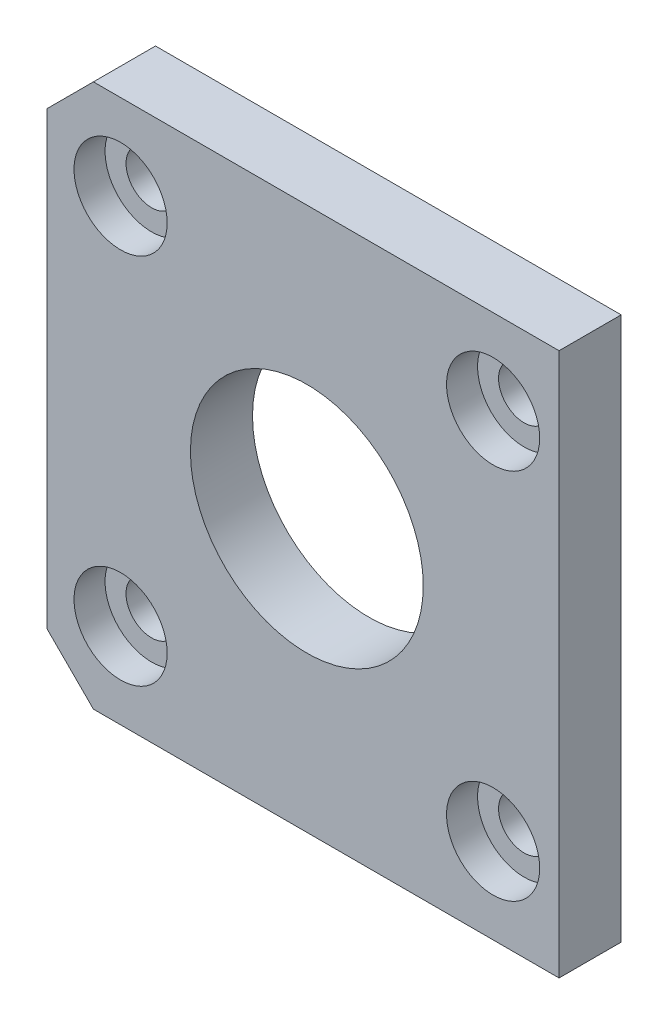
ISO-10303-21;
HEADER;
FILE_DESCRIPTION(('STEP AP214'),'2;1');
FILE_NAME('part.step','',(''),(''),'','','');
FILE_SCHEMA(('AUTOMOTIVE_DESIGN { 1 0 10303 214 1 1 1 1 }'));
ENDSEC;
DATA;
#1=APPLICATION_CONTEXT('core data for automotive mechanical design processes');
#2=APPLICATION_PROTOCOL_DEFINITION('international standard','automotive_design',2000,#1);
#3=PRODUCT_CONTEXT('',#1,'mechanical');
#4=PRODUCT('Part','Part','',(#3));
#5=PRODUCT_RELATED_PRODUCT_CATEGORY('part','',(#4));
#6=PRODUCT_DEFINITION_FORMATION('','',#4);
#7=PRODUCT_DEFINITION_CONTEXT('part definition',#1,'design');
#8=PRODUCT_DEFINITION('design','',#6,#7);
#9=PRODUCT_DEFINITION_SHAPE('','',#8);
#10=(LENGTH_UNIT() NAMED_UNIT(*) SI_UNIT(.MILLI.,.METRE.));
#11=(NAMED_UNIT(*) PLANE_ANGLE_UNIT() SI_UNIT($,.RADIAN.));
#12=(NAMED_UNIT(*) SI_UNIT($,.STERADIAN.) SOLID_ANGLE_UNIT());
#13=UNCERTAINTY_MEASURE_WITH_UNIT(LENGTH_MEASURE(1.E-05),#10,'distance_accuracy_value','');
#14=(GEOMETRIC_REPRESENTATION_CONTEXT(3) GLOBAL_UNCERTAINTY_ASSIGNED_CONTEXT((#13)) GLOBAL_UNIT_ASSIGNED_CONTEXT((#10,
#11,#12)) REPRESENTATION_CONTEXT('',''));
#15=CARTESIAN_POINT('',(0.,0.,0.));
#16=DIRECTION('',(0.,0.,1.));
#17=DIRECTION('',(1.,0.,0.));
#18=AXIS2_PLACEMENT_3D('',#15,#16,#17);
#19=CARTESIAN_POINT('',(4.75,29.5,4.));
#20=DIRECTION('',(0.,0.,-1.));
#21=DIRECTION('',(-1.,0.,0.));
#22=AXIS2_PLACEMENT_3D('',#19,#20,#21);
#23=CYLINDRICAL_SURFACE('',#22,1.65);
#24=CARTESIAN_POINT('',(4.75,29.5,0.));
#25=DIRECTION('',(0.,0.,1.));
#26=DIRECTION('',(1.,0.,0.));
#27=AXIS2_PLACEMENT_3D('',#24,#25,#26);
#28=CIRCLE('',#27,1.65);
#29=CARTESIAN_POINT('',(6.4,29.5,0.));
#30=VERTEX_POINT('',#29);
#31=EDGE_CURVE('E194',#30,#30,#28,.T.);
#32=ORIENTED_EDGE('',*,*,#31,.F.);
#33=EDGE_LOOP('',(#32));
#34=FACE_BOUND('',#33,.T.);
#35=CARTESIAN_POINT('',(4.75,29.5,2.));
#36=DIRECTION('',(0.,0.,1.));
#37=DIRECTION('',(1.,0.,0.));
#38=AXIS2_PLACEMENT_3D('',#35,#36,#37);
#39=CIRCLE('',#38,1.65);
#40=CARTESIAN_POINT('',(6.4,29.5,2.));
#41=VERTEX_POINT('',#40);
#42=EDGE_CURVE('E43',#41,#41,#39,.T.);
#43=ORIENTED_EDGE('',*,*,#42,.T.);
#44=EDGE_LOOP('',(#43));
#45=FACE_BOUND('',#44,.T.);
#46=ADVANCED_FACE('F39',(#34,#45),#23,.F.);
#47=CARTESIAN_POINT('',(28.75,29.5,4.));
#48=DIRECTION('',(0.,0.,-1.));
#49=DIRECTION('',(-1.,0.,0.));
#50=AXIS2_PLACEMENT_3D('',#47,#48,#49);
#51=CYLINDRICAL_SURFACE('',#50,1.65);
#52=CARTESIAN_POINT('',(28.75,29.5,0.));
#53=DIRECTION('',(0.,0.,1.));
#54=DIRECTION('',(1.,0.,0.));
#55=AXIS2_PLACEMENT_3D('',#52,#53,#54);
#56=CIRCLE('',#55,1.65);
#57=CARTESIAN_POINT('',(30.4,29.5,0.));
#58=VERTEX_POINT('',#57);
#59=EDGE_CURVE('E185',#58,#58,#56,.T.);
#60=ORIENTED_EDGE('',*,*,#59,.F.);
#61=EDGE_LOOP('',(#60));
#62=FACE_BOUND('',#61,.T.);
#63=CARTESIAN_POINT('',(28.75,29.5,2.));
#64=DIRECTION('',(0.,0.,1.));
#65=DIRECTION('',(1.,0.,0.));
#66=AXIS2_PLACEMENT_3D('',#63,#64,#65);
#67=CIRCLE('',#66,1.65);
#68=CARTESIAN_POINT('',(30.4,29.5,2.));
#69=VERTEX_POINT('',#68);
#70=EDGE_CURVE('E167',#69,#69,#67,.T.);
#71=ORIENTED_EDGE('',*,*,#70,.T.);
#72=EDGE_LOOP('',(#71));
#73=FACE_BOUND('',#72,.T.);
#74=ADVANCED_FACE('F234',(#62,#73),#51,.F.);
#75=CARTESIAN_POINT('',(4.75,5.5,4.));
#76=DIRECTION('',(0.,0.,-1.));
#77=DIRECTION('',(-1.,0.,0.));
#78=AXIS2_PLACEMENT_3D('',#75,#76,#77);
#79=CYLINDRICAL_SURFACE('',#78,1.65);
#80=CARTESIAN_POINT('',(4.75,5.5,0.));
#81=DIRECTION('',(0.,0.,1.));
#82=DIRECTION('',(1.,0.,0.));
#83=AXIS2_PLACEMENT_3D('',#80,#81,#82);
#84=CIRCLE('',#83,1.65);
#85=CARTESIAN_POINT('',(6.4,5.5,0.));
#86=VERTEX_POINT('',#85);
#87=EDGE_CURVE('E179',#86,#86,#84,.T.);
#88=ORIENTED_EDGE('',*,*,#87,.F.);
#89=EDGE_LOOP('',(#88));
#90=FACE_BOUND('',#89,.T.);
#91=CARTESIAN_POINT('',(4.75,5.5,2.));
#92=DIRECTION('',(0.,0.,1.));
#93=DIRECTION('',(1.,0.,0.));
#94=AXIS2_PLACEMENT_3D('',#91,#92,#93);
#95=CIRCLE('',#94,1.65);
#96=CARTESIAN_POINT('',(6.4,5.5,2.));
#97=VERTEX_POINT('',#96);
#98=EDGE_CURVE('E163',#97,#97,#95,.T.);
#99=ORIENTED_EDGE('',*,*,#98,.T.);
#100=EDGE_LOOP('',(#99));
#101=FACE_BOUND('',#100,.T.);
#102=ADVANCED_FACE('F240',(#90,#101),#79,.F.);
#103=CARTESIAN_POINT('',(28.75,5.5,4.));
#104=DIRECTION('',(0.,0.,-1.));
#105=DIRECTION('',(-1.,0.,0.));
#106=AXIS2_PLACEMENT_3D('',#103,#104,#105);
#107=CYLINDRICAL_SURFACE('',#106,1.65);
#108=CARTESIAN_POINT('',(28.75,5.5,0.));
#109=DIRECTION('',(0.,0.,1.));
#110=DIRECTION('',(1.,0.,0.));
#111=AXIS2_PLACEMENT_3D('',#108,#109,#110);
#112=CIRCLE('',#111,1.65);
#113=CARTESIAN_POINT('',(30.4,5.5,0.));
#114=VERTEX_POINT('',#113);
#115=EDGE_CURVE('E174',#114,#114,#112,.T.);
#116=ORIENTED_EDGE('',*,*,#115,.F.);
#117=EDGE_LOOP('',(#116));
#118=FACE_BOUND('',#117,.T.);
#119=CARTESIAN_POINT('',(28.75,5.5,2.));
#120=DIRECTION('',(0.,0.,1.));
#121=DIRECTION('',(1.,0.,0.));
#122=AXIS2_PLACEMENT_3D('',#119,#120,#121);
#123=CIRCLE('',#122,1.65);
#124=CARTESIAN_POINT('',(30.4,5.5,2.));
#125=VERTEX_POINT('',#124);
#126=EDGE_CURVE('E159',#125,#125,#123,.T.);
#127=ORIENTED_EDGE('',*,*,#126,.T.);
#128=EDGE_LOOP('',(#127));
#129=FACE_BOUND('',#128,.T.);
#130=ADVANCED_FACE('F247',(#118,#129),#107,.F.);
#131=CARTESIAN_POINT('',(0.,0.,4.));
#132=DIRECTION('',(0.,0.,-1.));
#133=DIRECTION('',(-1.,0.,0.));
#134=AXIS2_PLACEMENT_3D('',#131,#132,#133);
#135=PLANE('',#134);
#136=CARTESIAN_POINT('',(28.75,29.5,4.));
#137=DIRECTION('',(0.,0.,1.));
#138=DIRECTION('',(1.,0.,0.));
#139=AXIS2_PLACEMENT_3D('',#136,#137,#138);
#140=CIRCLE('',#139,2.99999999999999);
#141=CARTESIAN_POINT('',(31.75,29.5,4.));
#142=VERTEX_POINT('',#141);
#143=EDGE_CURVE('E272',#142,#142,#140,.T.);
#144=ORIENTED_EDGE('',*,*,#143,.F.);
#145=EDGE_LOOP('',(#144));
#146=FACE_BOUND('',#145,.T.);
#147=CARTESIAN_POINT('',(4.75,5.5,4.));
#148=DIRECTION('',(0.,0.,1.));
#149=DIRECTION('',(1.,0.,0.));
#150=AXIS2_PLACEMENT_3D('',#147,#148,#149);
#151=CIRCLE('',#150,3.);
#152=CARTESIAN_POINT('',(7.75,5.5,4.));
#153=VERTEX_POINT('',#152);
#154=EDGE_CURVE('E273',#153,#153,#151,.T.);
#155=ORIENTED_EDGE('',*,*,#154,.F.);
#156=EDGE_LOOP('',(#155));
#157=FACE_BOUND('',#156,.T.);
#158=CARTESIAN_POINT('',(28.75,5.5,4.));
#159=DIRECTION('',(0.,0.,1.));
#160=DIRECTION('',(1.,0.,0.));
#161=AXIS2_PLACEMENT_3D('',#158,#159,#160);
#162=CIRCLE('',#161,2.99999999999999);
#163=CARTESIAN_POINT('',(31.75,5.5,4.));
#164=VERTEX_POINT('',#163);
#165=EDGE_CURVE('E297',#164,#164,#162,.T.);
#166=ORIENTED_EDGE('',*,*,#165,.F.);
#167=EDGE_LOOP('',(#166));
#168=FACE_BOUND('',#167,.T.);
#169=CARTESIAN_POINT('',(4.75,29.5,4.));
#170=DIRECTION('',(0.,0.,1.));
#171=DIRECTION('',(1.,0.,0.));
#172=AXIS2_PLACEMENT_3D('',#169,#170,#171);
#173=CIRCLE('',#172,3.);
#174=CARTESIAN_POINT('',(7.75,29.5,4.));
#175=VERTEX_POINT('',#174);
#176=EDGE_CURVE('E188',#175,#175,#173,.T.);
#177=ORIENTED_EDGE('',*,*,#176,.F.);
#178=EDGE_LOOP('',(#177));
#179=FACE_BOUND('',#178,.T.);
#180=DIRECTION('',(0.,1.,0.));
#181=VECTOR('',#180,1.);
#182=CARTESIAN_POINT('',(33.,0.,4.));
#183=LINE('',#182,#181);
#184=CARTESIAN_POINT('',(33.,0.,4.));
#185=VERTEX_POINT('',#184);
#186=CARTESIAN_POINT('',(33.,35.,4.));
#187=VERTEX_POINT('',#186);
#188=EDGE_CURVE('E149',#185,#187,#183,.T.);
#189=ORIENTED_EDGE('',*,*,#188,.T.);
#190=DIRECTION('',(-1.,0.,0.));
#191=VECTOR('',#190,1.);
#192=CARTESIAN_POINT('',(3.,35.,4.));
#193=LINE('',#192,#191);
#194=CARTESIAN_POINT('',(3.,35.,4.));
#195=VERTEX_POINT('',#194);
#196=EDGE_CURVE('E96',#187,#195,#193,.T.);
#197=ORIENTED_EDGE('',*,*,#196,.T.);
#198=DIRECTION('',(-0.707106781186547,-0.707106781186548,0.));
#199=VECTOR('',#198,1.);
#200=CARTESIAN_POINT('',(0.,32.,4.));
#201=LINE('',#200,#199);
#202=CARTESIAN_POINT('',(0.,32.,4.));
#203=VERTEX_POINT('',#202);
#204=EDGE_CURVE('E110',#195,#203,#201,.T.);
#205=ORIENTED_EDGE('',*,*,#204,.T.);
#206=DIRECTION('',(0.,-1.,0.));
#207=VECTOR('',#206,1.);
#208=CARTESIAN_POINT('',(0.,3.,4.));
#209=LINE('',#208,#207);
#210=CARTESIAN_POINT('',(0.,3.,4.));
#211=VERTEX_POINT('',#210);
#212=EDGE_CURVE('E103',#203,#211,#209,.T.);
#213=ORIENTED_EDGE('',*,*,#212,.T.);
#214=DIRECTION('',(0.707106781186548,-0.707106781186548,0.));
#215=VECTOR('',#214,1.);
#216=CARTESIAN_POINT('',(0.,3.,4.));
#217=LINE('',#216,#215);
#218=CARTESIAN_POINT('',(3.,0.,4.));
#219=VERTEX_POINT('',#218);
#220=EDGE_CURVE('E108',#211,#219,#217,.T.);
#221=ORIENTED_EDGE('',*,*,#220,.T.);
#222=DIRECTION('',(1.,0.,0.));
#223=VECTOR('',#222,1.);
#224=CARTESIAN_POINT('',(3.,0.,4.));
#225=LINE('',#224,#223);
#226=EDGE_CURVE('E59',#219,#185,#225,.T.);
#227=ORIENTED_EDGE('',*,*,#226,.T.);
#228=EDGE_LOOP('',(#189,#197,#205,#213,#221,#227));
#229=FACE_BOUND('',#228,.T.);
#230=CARTESIAN_POINT('',(16.75,17.5,4.));
#231=DIRECTION('',(0.,0.,1.));
#232=DIRECTION('',(1.,0.,0.));
#233=AXIS2_PLACEMENT_3D('',#230,#231,#232);
#234=CIRCLE('',#233,7.5);
#235=CARTESIAN_POINT('',(24.25,17.5,4.));
#236=VERTEX_POINT('',#235);
#237=EDGE_CURVE('E137',#236,#236,#234,.T.);
#238=ORIENTED_EDGE('',*,*,#237,.F.);
#239=EDGE_LOOP('',(#238));
#240=FACE_BOUND('',#239,.T.);
#241=ADVANCED_FACE('F105',(#146,#157,#168,#179,#229,#240),#135,.F.);
#242=CARTESIAN_POINT('',(0.,0.,0.));
#243=DIRECTION('',(0.,0.,-1.));
#244=DIRECTION('',(-1.,0.,0.));
#245=AXIS2_PLACEMENT_3D('',#242,#243,#244);
#246=PLANE('',#245);
#247=ORIENTED_EDGE('',*,*,#87,.T.);
#248=EDGE_LOOP('',(#247));
#249=FACE_BOUND('',#248,.T.);
#250=ORIENTED_EDGE('',*,*,#31,.T.);
#251=EDGE_LOOP('',(#250));
#252=FACE_BOUND('',#251,.T.);
#253=DIRECTION('',(0.,1.,0.));
#254=VECTOR('',#253,1.);
#255=CARTESIAN_POINT('',(33.,0.,0.));
#256=LINE('',#255,#254);
#257=CARTESIAN_POINT('',(33.,0.,0.));
#258=VERTEX_POINT('',#257);
#259=CARTESIAN_POINT('',(33.,35.,0.));
#260=VERTEX_POINT('',#259);
#261=EDGE_CURVE('E132',#258,#260,#256,.T.);
#262=ORIENTED_EDGE('',*,*,#261,.F.);
#263=DIRECTION('',(1.,0.,0.));
#264=VECTOR('',#263,1.);
#265=CARTESIAN_POINT('',(3.,0.,0.));
#266=LINE('',#265,#264);
#267=CARTESIAN_POINT('',(3.,0.,0.));
#268=VERTEX_POINT('',#267);
#269=EDGE_CURVE('E88',#268,#258,#266,.T.);
#270=ORIENTED_EDGE('',*,*,#269,.F.);
#271=DIRECTION('',(0.707106781186548,-0.707106781186548,0.));
#272=VECTOR('',#271,1.);
#273=CARTESIAN_POINT('',(0.,3.,0.));
#274=LINE('',#273,#272);
#275=CARTESIAN_POINT('',(0.,3.,0.));
#276=VERTEX_POINT('',#275);
#277=EDGE_CURVE('E82',#276,#268,#274,.T.);
#278=ORIENTED_EDGE('',*,*,#277,.F.);
#279=DIRECTION('',(0.,-1.,0.));
#280=VECTOR('',#279,1.);
#281=CARTESIAN_POINT('',(0.,3.,0.));
#282=LINE('',#281,#280);
#283=CARTESIAN_POINT('',(0.,32.,0.));
#284=VERTEX_POINT('',#283);
#285=EDGE_CURVE('E119',#284,#276,#282,.T.);
#286=ORIENTED_EDGE('',*,*,#285,.F.);
#287=DIRECTION('',(-0.707106781186547,-0.707106781186548,0.));
#288=VECTOR('',#287,1.);
#289=CARTESIAN_POINT('',(0.,32.,0.));
#290=LINE('',#289,#288);
#291=CARTESIAN_POINT('',(3.,35.,0.));
#292=VERTEX_POINT('',#291);
#293=EDGE_CURVE('E140',#292,#284,#290,.T.);
#294=ORIENTED_EDGE('',*,*,#293,.F.);
#295=DIRECTION('',(-1.,0.,0.));
#296=VECTOR('',#295,1.);
#297=CARTESIAN_POINT('',(3.,35.,0.));
#298=LINE('',#297,#296);
#299=EDGE_CURVE('E136',#260,#292,#298,.T.);
#300=ORIENTED_EDGE('',*,*,#299,.F.);
#301=EDGE_LOOP('',(#262,#270,#278,#286,#294,#300));
#302=FACE_BOUND('',#301,.T.);
#303=CARTESIAN_POINT('',(16.75,17.5,0.));
#304=DIRECTION('',(0.,0.,1.));
#305=DIRECTION('',(1.,0.,0.));
#306=AXIS2_PLACEMENT_3D('',#303,#304,#305);
#307=CIRCLE('',#306,7.5);
#308=CARTESIAN_POINT('',(24.25,17.5,0.));
#309=VERTEX_POINT('',#308);
#310=EDGE_CURVE('E198',#309,#309,#307,.T.);
#311=ORIENTED_EDGE('',*,*,#310,.T.);
#312=EDGE_LOOP('',(#311));
#313=FACE_BOUND('',#312,.T.);
#314=ORIENTED_EDGE('',*,*,#59,.T.);
#315=EDGE_LOOP('',(#314));
#316=FACE_BOUND('',#315,.T.);
#317=ORIENTED_EDGE('',*,*,#115,.T.);
#318=EDGE_LOOP('',(#317));
#319=FACE_BOUND('',#318,.T.);
#320=ADVANCED_FACE('F217',(#249,#252,#302,#313,#316,#319),#246,.T.);
#321=CARTESIAN_POINT('',(33.,0.,4.));
#322=DIRECTION('',(-1.,0.,0.));
#323=DIRECTION('',(0.,0.,1.));
#324=AXIS2_PLACEMENT_3D('',#321,#322,#323);
#325=PLANE('',#324);
#326=ORIENTED_EDGE('',*,*,#261,.T.);
#327=DIRECTION('',(0.,0.,-1.));
#328=VECTOR('',#327,1.);
#329=CARTESIAN_POINT('',(33.,35.,4.));
#330=LINE('',#329,#328);
#331=EDGE_CURVE('E11',#187,#260,#330,.T.);
#332=ORIENTED_EDGE('',*,*,#331,.F.);
#333=ORIENTED_EDGE('',*,*,#188,.F.);
#334=DIRECTION('',(0.,0.,-1.));
#335=VECTOR('',#334,1.);
#336=CARTESIAN_POINT('',(33.,0.,4.));
#337=LINE('',#336,#335);
#338=EDGE_CURVE('E128',#185,#258,#337,.T.);
#339=ORIENTED_EDGE('',*,*,#338,.T.);
#340=EDGE_LOOP('',(#326,#332,#333,#339));
#341=FACE_BOUND('',#340,.T.);
#342=ADVANCED_FACE('F41',(#341),#325,.F.);
#343=CARTESIAN_POINT('',(3.,35.,4.));
#344=DIRECTION('',(0.,-1.,0.));
#345=DIRECTION('',(0.,0.,-1.));
#346=AXIS2_PLACEMENT_3D('',#343,#344,#345);
#347=PLANE('',#346);
#348=ORIENTED_EDGE('',*,*,#299,.T.);
#349=DIRECTION('',(0.,0.,-1.));
#350=VECTOR('',#349,1.);
#351=CARTESIAN_POINT('',(3.,35.,4.));
#352=LINE('',#351,#350);
#353=EDGE_CURVE('E50',#195,#292,#352,.T.);
#354=ORIENTED_EDGE('',*,*,#353,.F.);
#355=ORIENTED_EDGE('',*,*,#196,.F.);
#356=ORIENTED_EDGE('',*,*,#331,.T.);
#357=EDGE_LOOP('',(#348,#354,#355,#356));
#358=FACE_BOUND('',#357,.T.);
#359=ADVANCED_FACE('F211',(#358),#347,.F.);
#360=CARTESIAN_POINT('',(0.,32.,4.));
#361=DIRECTION('',(0.707106781186548,-0.707106781186547,0.));
#362=DIRECTION('',(0.707106781186547,0.707106781186548,0.));
#363=AXIS2_PLACEMENT_3D('',#360,#361,#362);
#364=PLANE('',#363);
#365=ORIENTED_EDGE('',*,*,#293,.T.);
#366=DIRECTION('',(0.,0.,-1.));
#367=VECTOR('',#366,1.);
#368=CARTESIAN_POINT('',(0.,32.,4.));
#369=LINE('',#368,#367);
#370=EDGE_CURVE('E121',#203,#284,#369,.T.);
#371=ORIENTED_EDGE('',*,*,#370,.F.);
#372=ORIENTED_EDGE('',*,*,#204,.F.);
#373=ORIENTED_EDGE('',*,*,#353,.T.);
#374=EDGE_LOOP('',(#365,#371,#372,#373));
#375=FACE_BOUND('',#374,.T.);
#376=ADVANCED_FACE('F214',(#375),#364,.F.);
#377=CARTESIAN_POINT('',(0.,3.,4.));
#378=DIRECTION('',(1.,0.,0.));
#379=DIRECTION('',(0.,0.,-1.));
#380=AXIS2_PLACEMENT_3D('',#377,#378,#379);
#381=PLANE('',#380);
#382=ORIENTED_EDGE('',*,*,#285,.T.);
#383=DIRECTION('',(0.,0.,-1.));
#384=VECTOR('',#383,1.);
#385=CARTESIAN_POINT('',(0.,3.,4.));
#386=LINE('',#385,#384);
#387=EDGE_CURVE('E116',#211,#276,#386,.T.);
#388=ORIENTED_EDGE('',*,*,#387,.F.);
#389=ORIENTED_EDGE('',*,*,#212,.F.);
#390=ORIENTED_EDGE('',*,*,#370,.T.);
#391=EDGE_LOOP('',(#382,#388,#389,#390));
#392=FACE_BOUND('',#391,.T.);
#393=ADVANCED_FACE('F117',(#392),#381,.F.);
#394=CARTESIAN_POINT('',(0.,3.,4.));
#395=DIRECTION('',(0.707106781186547,0.707106781186547,0.));
#396=DIRECTION('',(-0.707106781186548,0.707106781186548,0.));
#397=AXIS2_PLACEMENT_3D('',#394,#395,#396);
#398=PLANE('',#397);
#399=ORIENTED_EDGE('',*,*,#277,.T.);
#400=DIRECTION('',(0.,0.,-1.));
#401=VECTOR('',#400,1.);
#402=CARTESIAN_POINT('',(3.,0.,4.));
#403=LINE('',#402,#401);
#404=EDGE_CURVE('E122',#219,#268,#403,.T.);
#405=ORIENTED_EDGE('',*,*,#404,.F.);
#406=ORIENTED_EDGE('',*,*,#220,.F.);
#407=ORIENTED_EDGE('',*,*,#387,.T.);
#408=EDGE_LOOP('',(#399,#405,#406,#407));
#409=FACE_BOUND('',#408,.T.);
#410=ADVANCED_FACE('F124',(#409),#398,.F.);
#411=CARTESIAN_POINT('',(3.,0.,4.));
#412=DIRECTION('',(0.,1.,0.));
#413=DIRECTION('',(0.,0.,1.));
#414=AXIS2_PLACEMENT_3D('',#411,#412,#413);
#415=PLANE('',#414);
#416=ORIENTED_EDGE('',*,*,#269,.T.);
#417=ORIENTED_EDGE('',*,*,#338,.F.);
#418=ORIENTED_EDGE('',*,*,#226,.F.);
#419=ORIENTED_EDGE('',*,*,#404,.T.);
#420=EDGE_LOOP('',(#416,#417,#418,#419));
#421=FACE_BOUND('',#420,.T.);
#422=ADVANCED_FACE('F220',(#421),#415,.F.);
#423=CARTESIAN_POINT('',(16.75,17.5,4.));
#424=DIRECTION('',(0.,0.,-1.));
#425=DIRECTION('',(-1.,0.,0.));
#426=AXIS2_PLACEMENT_3D('',#423,#424,#425);
#427=CYLINDRICAL_SURFACE('',#426,7.5);
#428=ORIENTED_EDGE('',*,*,#237,.T.);
#429=EDGE_LOOP('',(#428));
#430=FACE_BOUND('',#429,.T.);
#431=ORIENTED_EDGE('',*,*,#310,.F.);
#432=EDGE_LOOP('',(#431));
#433=FACE_BOUND('',#432,.T.);
#434=ADVANCED_FACE('F222',(#430,#433),#427,.F.);
#435=CARTESIAN_POINT('',(28.75,5.5,2.));
#436=DIRECTION('',(0.,0.,1.));
#437=DIRECTION('',(1.,0.,0.));
#438=AXIS2_PLACEMENT_3D('',#435,#436,#437);
#439=CYLINDRICAL_SURFACE('',#438,2.99999999999999);
#440=CARTESIAN_POINT('',(28.75,5.5,2.));
#441=DIRECTION('',(0.,0.,1.));
#442=DIRECTION('',(1.,0.,0.));
#443=AXIS2_PLACEMENT_3D('',#440,#441,#442);
#444=CIRCLE('',#443,2.99999999999999);
#445=CARTESIAN_POINT('',(31.75,5.5,2.));
#446=VERTEX_POINT('',#445);
#447=EDGE_CURVE('E281',#446,#446,#444,.T.);
#448=ORIENTED_EDGE('',*,*,#447,.F.);
#449=EDGE_LOOP('',(#448));
#450=FACE_BOUND('',#449,.T.);
#451=ORIENTED_EDGE('',*,*,#165,.T.);
#452=EDGE_LOOP('',(#451));
#453=FACE_BOUND('',#452,.T.);
#454=ADVANCED_FACE('F228',(#450,#453),#439,.F.);
#455=CARTESIAN_POINT('',(28.75,5.5,2.));
#456=DIRECTION('',(0.,0.,1.));
#457=DIRECTION('',(1.,0.,0.));
#458=AXIS2_PLACEMENT_3D('',#455,#456,#457);
#459=PLANE('',#458);
#460=ORIENTED_EDGE('',*,*,#126,.F.);
#461=EDGE_LOOP('',(#460));
#462=FACE_BOUND('',#461,.T.);
#463=ORIENTED_EDGE('',*,*,#447,.T.);
#464=EDGE_LOOP('',(#463));
#465=FACE_BOUND('',#464,.T.);
#466=ADVANCED_FACE('F305',(#462,#465),#459,.T.);
#467=CARTESIAN_POINT('',(4.75,5.5,2.));
#468=DIRECTION('',(0.,0.,1.));
#469=DIRECTION('',(1.,0.,0.));
#470=AXIS2_PLACEMENT_3D('',#467,#468,#469);
#471=CYLINDRICAL_SURFACE('',#470,3.);
#472=CARTESIAN_POINT('',(4.75,5.5,2.));
#473=DIRECTION('',(0.,0.,1.));
#474=DIRECTION('',(1.,0.,0.));
#475=AXIS2_PLACEMENT_3D('',#472,#473,#474);
#476=CIRCLE('',#475,3.);
#477=CARTESIAN_POINT('',(7.75,5.5,2.));
#478=VERTEX_POINT('',#477);
#479=EDGE_CURVE('E269',#478,#478,#476,.T.);
#480=ORIENTED_EDGE('',*,*,#479,.F.);
#481=EDGE_LOOP('',(#480));
#482=FACE_BOUND('',#481,.T.);
#483=ORIENTED_EDGE('',*,*,#154,.T.);
#484=EDGE_LOOP('',(#483));
#485=FACE_BOUND('',#484,.T.);
#486=ADVANCED_FACE('F265',(#482,#485),#471,.F.);
#487=CARTESIAN_POINT('',(4.75,5.5,2.));
#488=DIRECTION('',(0.,0.,1.));
#489=DIRECTION('',(1.,0.,0.));
#490=AXIS2_PLACEMENT_3D('',#487,#488,#489);
#491=PLANE('',#490);
#492=ORIENTED_EDGE('',*,*,#98,.F.);
#493=EDGE_LOOP('',(#492));
#494=FACE_BOUND('',#493,.T.);
#495=ORIENTED_EDGE('',*,*,#479,.T.);
#496=EDGE_LOOP('',(#495));
#497=FACE_BOUND('',#496,.T.);
#498=ADVANCED_FACE('F261',(#494,#497),#491,.T.);
#499=CARTESIAN_POINT('',(28.75,29.5,2.));
#500=DIRECTION('',(0.,0.,1.));
#501=DIRECTION('',(1.,0.,0.));
#502=AXIS2_PLACEMENT_3D('',#499,#500,#501);
#503=CYLINDRICAL_SURFACE('',#502,2.99999999999999);
#504=CARTESIAN_POINT('',(28.75,29.5,2.));
#505=DIRECTION('',(0.,0.,1.));
#506=DIRECTION('',(1.,0.,0.));
#507=AXIS2_PLACEMENT_3D('',#504,#505,#506);
#508=CIRCLE('',#507,2.99999999999999);
#509=CARTESIAN_POINT('',(31.75,29.5,2.));
#510=VERTEX_POINT('',#509);
#511=EDGE_CURVE('E278',#510,#510,#508,.T.);
#512=ORIENTED_EDGE('',*,*,#511,.F.);
#513=EDGE_LOOP('',(#512));
#514=FACE_BOUND('',#513,.T.);
#515=ORIENTED_EDGE('',*,*,#143,.T.);
#516=EDGE_LOOP('',(#515));
#517=FACE_BOUND('',#516,.T.);
#518=ADVANCED_FACE('F264',(#514,#517),#503,.F.);
#519=CARTESIAN_POINT('',(28.75,29.5,2.));
#520=DIRECTION('',(0.,0.,1.));
#521=DIRECTION('',(1.,0.,0.));
#522=AXIS2_PLACEMENT_3D('',#519,#520,#521);
#523=PLANE('',#522);
#524=ORIENTED_EDGE('',*,*,#70,.F.);
#525=EDGE_LOOP('',(#524));
#526=FACE_BOUND('',#525,.T.);
#527=ORIENTED_EDGE('',*,*,#511,.T.);
#528=EDGE_LOOP('',(#527));
#529=FACE_BOUND('',#528,.T.);
#530=ADVANCED_FACE('F319',(#526,#529),#523,.T.);
#531=CARTESIAN_POINT('',(4.75,29.5,2.));
#532=DIRECTION('',(0.,0.,1.));
#533=DIRECTION('',(1.,0.,0.));
#534=AXIS2_PLACEMENT_3D('',#531,#532,#533);
#535=CYLINDRICAL_SURFACE('',#534,3.);
#536=CARTESIAN_POINT('',(4.75,29.5,2.));
#537=DIRECTION('',(0.,0.,1.));
#538=DIRECTION('',(1.,0.,0.));
#539=AXIS2_PLACEMENT_3D('',#536,#537,#538);
#540=CIRCLE('',#539,3.);
#541=CARTESIAN_POINT('',(7.75,29.5,2.));
#542=VERTEX_POINT('',#541);
#543=EDGE_CURVE('E164',#542,#542,#540,.T.);
#544=ORIENTED_EDGE('',*,*,#543,.F.);
#545=EDGE_LOOP('',(#544));
#546=FACE_BOUND('',#545,.T.);
#547=ORIENTED_EDGE('',*,*,#176,.T.);
#548=EDGE_LOOP('',(#547));
#549=FACE_BOUND('',#548,.T.);
#550=ADVANCED_FACE('F322',(#546,#549),#535,.F.);
#551=CARTESIAN_POINT('',(4.75,29.5,2.));
#552=DIRECTION('',(0.,0.,1.));
#553=DIRECTION('',(1.,0.,0.));
#554=AXIS2_PLACEMENT_3D('',#551,#552,#553);
#555=PLANE('',#554);
#556=ORIENTED_EDGE('',*,*,#42,.F.);
#557=EDGE_LOOP('',(#556));
#558=FACE_BOUND('',#557,.T.);
#559=ORIENTED_EDGE('',*,*,#543,.T.);
#560=EDGE_LOOP('',(#559));
#561=FACE_BOUND('',#560,.T.);
#562=ADVANCED_FACE('F329',(#558,#561),#555,.T.);
#563=CLOSED_SHELL('',(#46,#74,#102,#130,#241,#320,#342,#359,#376,#393,#410,#422,#434,#454,#466,
#486,#498,#518,#530,#550,#562));
#564=MANIFOLD_SOLID_BREP('B2',#563);
#565=ADVANCED_BREP_SHAPE_REPRESENTATION('',(#18,#564),#14);
#566=SHAPE_DEFINITION_REPRESENTATION(#9,#565);
ENDSEC;
END-ISO-10303-21;
